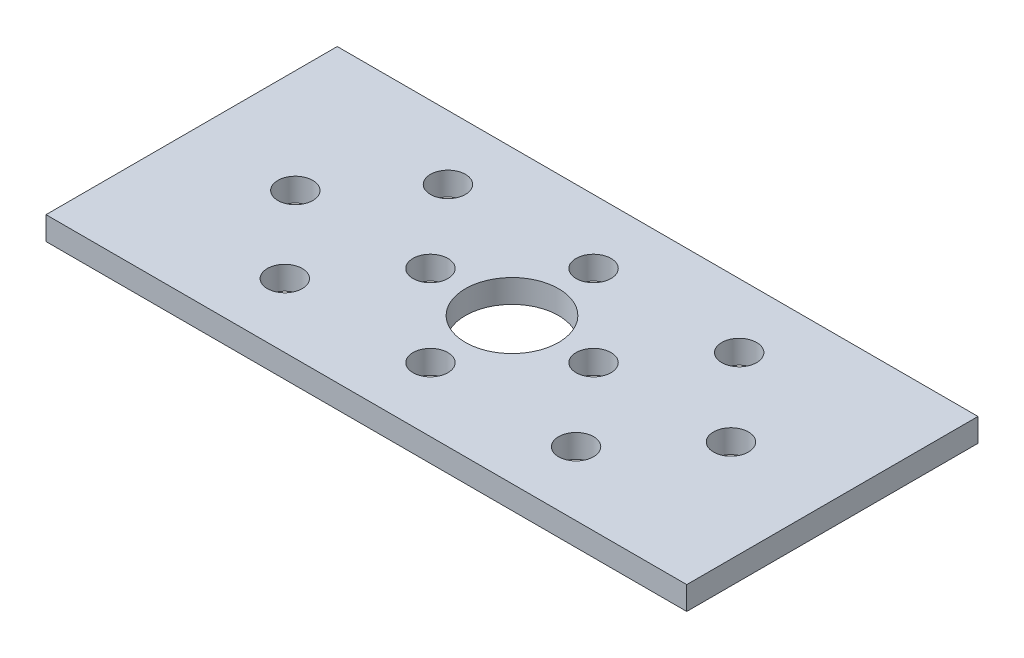
ISO-10303-21;
HEADER;
FILE_DESCRIPTION(('STEP AP214'),'2;1');
FILE_NAME('part.step','',(''),(''),'','','');
FILE_SCHEMA(('AUTOMOTIVE_DESIGN { 1 0 10303 214 1 1 1 1 }'));
ENDSEC;
DATA;
#1=APPLICATION_CONTEXT('core data for automotive mechanical design processes');
#2=APPLICATION_PROTOCOL_DEFINITION('international standard','automotive_design',2000,#1);
#3=PRODUCT_CONTEXT('',#1,'mechanical');
#4=PRODUCT('Part','Part','',(#3));
#5=PRODUCT_RELATED_PRODUCT_CATEGORY('part','',(#4));
#6=PRODUCT_DEFINITION_FORMATION('','',#4);
#7=PRODUCT_DEFINITION_CONTEXT('part definition',#1,'design');
#8=PRODUCT_DEFINITION('design','',#6,#7);
#9=PRODUCT_DEFINITION_SHAPE('','',#8);
#10=(LENGTH_UNIT() NAMED_UNIT(*) SI_UNIT(.MILLI.,.METRE.));
#11=(NAMED_UNIT(*) PLANE_ANGLE_UNIT() SI_UNIT($,.RADIAN.));
#12=(NAMED_UNIT(*) SI_UNIT($,.STERADIAN.) SOLID_ANGLE_UNIT());
#13=UNCERTAINTY_MEASURE_WITH_UNIT(LENGTH_MEASURE(1.E-05),#10,'distance_accuracy_value','');
#14=(GEOMETRIC_REPRESENTATION_CONTEXT(3) GLOBAL_UNCERTAINTY_ASSIGNED_CONTEXT((#13)) GLOBAL_UNIT_ASSIGNED_CONTEXT((#10,
#11,#12)) REPRESENTATION_CONTEXT('',''));
#15=CARTESIAN_POINT('',(0.,0.,0.));
#16=DIRECTION('',(0.,0.,1.));
#17=DIRECTION('',(1.,0.,0.));
#18=AXIS2_PLACEMENT_3D('',#15,#16,#17);
#19=CARTESIAN_POINT('',(0.,2.,0.));
#20=DIRECTION('',(0.,-1.,0.));
#21=DIRECTION('',(0.,0.,-1.));
#22=AXIS2_PLACEMENT_3D('',#19,#20,#21);
#23=PLANE('',#22);
#24=DIRECTION('',(0.,0.,-1.));
#25=VECTOR('',#24,1.);
#26=CARTESIAN_POINT('',(27.5,2.,12.5));
#27=LINE('',#26,#25);
#28=CARTESIAN_POINT('',(27.5,2.,12.5));
#29=VERTEX_POINT('',#28);
#30=CARTESIAN_POINT('',(27.5,2.,-12.5));
#31=VERTEX_POINT('',#30);
#32=EDGE_CURVE('E85',#29,#31,#27,.T.);
#33=ORIENTED_EDGE('',*,*,#32,.T.);
#34=DIRECTION('',(-1.,0.,0.));
#35=VECTOR('',#34,1.);
#36=CARTESIAN_POINT('',(-27.5,2.,-12.5));
#37=LINE('',#36,#35);
#38=CARTESIAN_POINT('',(-27.5,2.,-12.5));
#39=VERTEX_POINT('',#38);
#40=EDGE_CURVE('E80',#31,#39,#37,.T.);
#41=ORIENTED_EDGE('',*,*,#40,.T.);
#42=DIRECTION('',(0.,0.,1.));
#43=VECTOR('',#42,1.);
#44=CARTESIAN_POINT('',(-27.5,2.,12.5));
#45=LINE('',#44,#43);
#46=CARTESIAN_POINT('',(-27.5,2.,12.5));
#47=VERTEX_POINT('',#46);
#48=EDGE_CURVE('E83',#39,#47,#45,.T.);
#49=ORIENTED_EDGE('',*,*,#48,.T.);
#50=DIRECTION('',(1.,0.,0.));
#51=VECTOR('',#50,1.);
#52=CARTESIAN_POINT('',(-27.5,2.,12.5));
#53=LINE('',#52,#51);
#54=EDGE_CURVE('E50',#47,#29,#53,.T.);
#55=ORIENTED_EDGE('',*,*,#54,.T.);
#56=EDGE_LOOP('',(#33,#41,#49,#55));
#57=FACE_BOUND('',#56,.T.);
#58=CARTESIAN_POINT('',(0.,2.,-7.));
#59=DIRECTION('',(0.,1.,0.));
#60=DIRECTION('',(0.,0.,1.));
#61=AXIS2_PLACEMENT_3D('',#58,#59,#60);
#62=CIRCLE('',#61,1.5);
#63=CARTESIAN_POINT('',(0.,2.,-5.5));
#64=VERTEX_POINT('',#63);
#65=EDGE_CURVE('E100',#64,#64,#62,.T.);
#66=ORIENTED_EDGE('',*,*,#65,.F.);
#67=EDGE_LOOP('',(#66));
#68=FACE_BOUND('',#67,.T.);
#69=CARTESIAN_POINT('',(7.,2.,0.));
#70=DIRECTION('',(0.,1.,0.));
#71=DIRECTION('',(0.,0.,1.));
#72=AXIS2_PLACEMENT_3D('',#69,#70,#71);
#73=CIRCLE('',#72,1.5);
#74=CARTESIAN_POINT('',(7.,2.,1.5));
#75=VERTEX_POINT('',#74);
#76=EDGE_CURVE('E115',#75,#75,#73,.T.);
#77=ORIENTED_EDGE('',*,*,#76,.F.);
#78=EDGE_LOOP('',(#77));
#79=FACE_BOUND('',#78,.T.);
#80=CARTESIAN_POINT('',(0.,2.,7.));
#81=DIRECTION('',(0.,1.,0.));
#82=DIRECTION('',(0.,0.,1.));
#83=AXIS2_PLACEMENT_3D('',#80,#81,#82);
#84=CIRCLE('',#83,1.5);
#85=CARTESIAN_POINT('',(0.,2.,8.5));
#86=VERTEX_POINT('',#85);
#87=EDGE_CURVE('E121',#86,#86,#84,.T.);
#88=ORIENTED_EDGE('',*,*,#87,.F.);
#89=EDGE_LOOP('',(#88));
#90=FACE_BOUND('',#89,.T.);
#91=CARTESIAN_POINT('',(-7.,2.,0.));
#92=DIRECTION('',(0.,1.,0.));
#93=DIRECTION('',(0.,0.,1.));
#94=AXIS2_PLACEMENT_3D('',#91,#92,#93);
#95=CIRCLE('',#94,1.5);
#96=CARTESIAN_POINT('',(-7.,2.,1.5));
#97=VERTEX_POINT('',#96);
#98=EDGE_CURVE('E127',#97,#97,#95,.T.);
#99=ORIENTED_EDGE('',*,*,#98,.F.);
#100=EDGE_LOOP('',(#99));
#101=FACE_BOUND('',#100,.T.);
#102=CARTESIAN_POINT('',(-18.5986879373947,2.,0.));
#103=DIRECTION('',(0.,1.,0.));
#104=DIRECTION('',(0.,0.,1.));
#105=AXIS2_PLACEMENT_3D('',#102,#103,#104);
#106=CIRCLE('',#105,1.5);
#107=CARTESIAN_POINT('',(-18.5986879373947,2.,1.5));
#108=VERTEX_POINT('',#107);
#109=EDGE_CURVE('E133',#108,#108,#106,.T.);
#110=ORIENTED_EDGE('',*,*,#109,.F.);
#111=EDGE_LOOP('',(#110));
#112=FACE_BOUND('',#111,.T.);
#113=CARTESIAN_POINT('',(12.5,2.,-7.));
#114=DIRECTION('',(0.,1.,0.));
#115=DIRECTION('',(0.,0.,1.));
#116=AXIS2_PLACEMENT_3D('',#113,#114,#115);
#117=CIRCLE('',#116,1.5);
#118=CARTESIAN_POINT('',(12.5,2.,-5.5));
#119=VERTEX_POINT('',#118);
#120=EDGE_CURVE('E139',#119,#119,#117,.T.);
#121=ORIENTED_EDGE('',*,*,#120,.F.);
#122=EDGE_LOOP('',(#121));
#123=FACE_BOUND('',#122,.T.);
#124=CARTESIAN_POINT('',(12.5,2.,7.));
#125=DIRECTION('',(0.,1.,0.));
#126=DIRECTION('',(0.,0.,-1.));
#127=AXIS2_PLACEMENT_3D('',#124,#125,#126);
#128=CIRCLE('',#127,1.5);
#129=CARTESIAN_POINT('',(12.5,2.,5.5));
#130=VERTEX_POINT('',#129);
#131=EDGE_CURVE('E145',#130,#130,#128,.T.);
#132=ORIENTED_EDGE('',*,*,#131,.F.);
#133=EDGE_LOOP('',(#132));
#134=FACE_BOUND('',#133,.T.);
#135=CARTESIAN_POINT('',(-12.5,2.,7.));
#136=DIRECTION('',(0.,1.,0.));
#137=DIRECTION('',(0.,0.,1.));
#138=AXIS2_PLACEMENT_3D('',#135,#136,#137);
#139=CIRCLE('',#138,1.5);
#140=CARTESIAN_POINT('',(-12.5,2.,8.5));
#141=VERTEX_POINT('',#140);
#142=EDGE_CURVE('E151',#141,#141,#139,.T.);
#143=ORIENTED_EDGE('',*,*,#142,.F.);
#144=EDGE_LOOP('',(#143));
#145=FACE_BOUND('',#144,.T.);
#146=CARTESIAN_POINT('',(0.,2.,0.));
#147=DIRECTION('',(0.,1.,0.));
#148=DIRECTION('',(0.,0.,1.));
#149=AXIS2_PLACEMENT_3D('',#146,#147,#148);
#150=CIRCLE('',#149,4.);
#151=CARTESIAN_POINT('',(0.,2.,4.));
#152=VERTEX_POINT('',#151);
#153=EDGE_CURVE('E157',#152,#152,#150,.T.);
#154=ORIENTED_EDGE('',*,*,#153,.F.);
#155=EDGE_LOOP('',(#154));
#156=FACE_BOUND('',#155,.T.);
#157=CARTESIAN_POINT('',(18.7959419436398,2.,0.));
#158=DIRECTION('',(0.,1.,0.));
#159=DIRECTION('',(0.,0.,1.));
#160=AXIS2_PLACEMENT_3D('',#157,#158,#159);
#161=CIRCLE('',#160,1.5);
#162=CARTESIAN_POINT('',(18.7959419436398,2.,1.5));
#163=VERTEX_POINT('',#162);
#164=EDGE_CURVE('E163',#163,#163,#161,.T.);
#165=ORIENTED_EDGE('',*,*,#164,.F.);
#166=EDGE_LOOP('',(#165));
#167=FACE_BOUND('',#166,.T.);
#168=CARTESIAN_POINT('',(-12.5,2.,-7.));
#169=DIRECTION('',(0.,1.,0.));
#170=DIRECTION('',(0.,0.,-1.));
#171=AXIS2_PLACEMENT_3D('',#168,#169,#170);
#172=CIRCLE('',#171,1.5);
#173=CARTESIAN_POINT('',(-12.5,2.,-8.5));
#174=VERTEX_POINT('',#173);
#175=EDGE_CURVE('E169',#174,#174,#172,.T.);
#176=ORIENTED_EDGE('',*,*,#175,.F.);
#177=EDGE_LOOP('',(#176));
#178=FACE_BOUND('',#177,.T.);
#179=ADVANCED_FACE('F33',(#57,#68,#79,#90,#101,#112,#123,#134,#145,#156,#167,#178),#23,.F.);
#180=CARTESIAN_POINT('',(0.,0.,0.));
#181=DIRECTION('',(0.,-1.,0.));
#182=DIRECTION('',(0.,0.,-1.));
#183=AXIS2_PLACEMENT_3D('',#180,#181,#182);
#184=PLANE('',#183);
#185=CARTESIAN_POINT('',(18.7959419436398,0.,0.));
#186=DIRECTION('',(0.,1.,0.));
#187=DIRECTION('',(0.,0.,1.));
#188=AXIS2_PLACEMENT_3D('',#185,#186,#187);
#189=CIRCLE('',#188,1.5);
#190=CARTESIAN_POINT('',(18.7959419436398,0.,1.5));
#191=VERTEX_POINT('',#190);
#192=EDGE_CURVE('E166',#191,#191,#189,.T.);
#193=ORIENTED_EDGE('',*,*,#192,.T.);
#194=EDGE_LOOP('',(#193));
#195=FACE_BOUND('',#194,.T.);
#196=CARTESIAN_POINT('',(-12.5,0.,7.));
#197=DIRECTION('',(0.,1.,0.));
#198=DIRECTION('',(0.,0.,1.));
#199=AXIS2_PLACEMENT_3D('',#196,#197,#198);
#200=CIRCLE('',#199,1.5);
#201=CARTESIAN_POINT('',(-12.5,0.,8.5));
#202=VERTEX_POINT('',#201);
#203=EDGE_CURVE('E154',#202,#202,#200,.T.);
#204=ORIENTED_EDGE('',*,*,#203,.T.);
#205=EDGE_LOOP('',(#204));
#206=FACE_BOUND('',#205,.T.);
#207=CARTESIAN_POINT('',(12.5,0.,-7.));
#208=DIRECTION('',(0.,1.,0.));
#209=DIRECTION('',(0.,0.,1.));
#210=AXIS2_PLACEMENT_3D('',#207,#208,#209);
#211=CIRCLE('',#210,1.5);
#212=CARTESIAN_POINT('',(12.5,0.,-5.5));
#213=VERTEX_POINT('',#212);
#214=EDGE_CURVE('E142',#213,#213,#211,.T.);
#215=ORIENTED_EDGE('',*,*,#214,.T.);
#216=EDGE_LOOP('',(#215));
#217=FACE_BOUND('',#216,.T.);
#218=CARTESIAN_POINT('',(-7.,0.,0.));
#219=DIRECTION('',(0.,1.,0.));
#220=DIRECTION('',(0.,0.,1.));
#221=AXIS2_PLACEMENT_3D('',#218,#219,#220);
#222=CIRCLE('',#221,1.5);
#223=CARTESIAN_POINT('',(-7.,0.,1.5));
#224=VERTEX_POINT('',#223);
#225=EDGE_CURVE('E130',#224,#224,#222,.T.);
#226=ORIENTED_EDGE('',*,*,#225,.T.);
#227=EDGE_LOOP('',(#226));
#228=FACE_BOUND('',#227,.T.);
#229=CARTESIAN_POINT('',(7.,0.,0.));
#230=DIRECTION('',(0.,1.,0.));
#231=DIRECTION('',(0.,0.,1.));
#232=AXIS2_PLACEMENT_3D('',#229,#230,#231);
#233=CIRCLE('',#232,1.5);
#234=CARTESIAN_POINT('',(7.,0.,1.5));
#235=VERTEX_POINT('',#234);
#236=EDGE_CURVE('E118',#235,#235,#233,.T.);
#237=ORIENTED_EDGE('',*,*,#236,.T.);
#238=EDGE_LOOP('',(#237));
#239=FACE_BOUND('',#238,.T.);
#240=DIRECTION('',(0.,0.,-1.));
#241=VECTOR('',#240,1.);
#242=CARTESIAN_POINT('',(27.5,0.,12.5));
#243=LINE('',#242,#241);
#244=CARTESIAN_POINT('',(27.5,0.,12.5));
#245=VERTEX_POINT('',#244);
#246=CARTESIAN_POINT('',(27.5,0.,-12.5));
#247=VERTEX_POINT('',#246);
#248=EDGE_CURVE('E97',#245,#247,#243,.T.);
#249=ORIENTED_EDGE('',*,*,#248,.F.);
#250=DIRECTION('',(1.,0.,0.));
#251=VECTOR('',#250,1.);
#252=CARTESIAN_POINT('',(-27.5,0.,12.5));
#253=LINE('',#252,#251);
#254=CARTESIAN_POINT('',(-27.5,0.,12.5));
#255=VERTEX_POINT('',#254);
#256=EDGE_CURVE('E73',#255,#245,#253,.T.);
#257=ORIENTED_EDGE('',*,*,#256,.F.);
#258=DIRECTION('',(0.,0.,1.));
#259=VECTOR('',#258,1.);
#260=CARTESIAN_POINT('',(-27.5,0.,12.5));
#261=LINE('',#260,#259);
#262=CARTESIAN_POINT('',(-27.5,0.,-12.5));
#263=VERTEX_POINT('',#262);
#264=EDGE_CURVE('E67',#263,#255,#261,.T.);
#265=ORIENTED_EDGE('',*,*,#264,.F.);
#266=DIRECTION('',(-1.,0.,0.));
#267=VECTOR('',#266,1.);
#268=CARTESIAN_POINT('',(-27.5,0.,-12.5));
#269=LINE('',#268,#267);
#270=EDGE_CURVE('E89',#247,#263,#269,.T.);
#271=ORIENTED_EDGE('',*,*,#270,.F.);
#272=EDGE_LOOP('',(#249,#257,#265,#271));
#273=FACE_BOUND('',#272,.T.);
#274=CARTESIAN_POINT('',(0.,0.,-7.));
#275=DIRECTION('',(0.,1.,0.));
#276=DIRECTION('',(0.,0.,1.));
#277=AXIS2_PLACEMENT_3D('',#274,#275,#276);
#278=CIRCLE('',#277,1.5);
#279=CARTESIAN_POINT('',(0.,0.,-5.5));
#280=VERTEX_POINT('',#279);
#281=EDGE_CURVE('E112',#280,#280,#278,.T.);
#282=ORIENTED_EDGE('',*,*,#281,.T.);
#283=EDGE_LOOP('',(#282));
#284=FACE_BOUND('',#283,.T.);
#285=CARTESIAN_POINT('',(0.,0.,7.));
#286=DIRECTION('',(0.,1.,0.));
#287=DIRECTION('',(0.,0.,1.));
#288=AXIS2_PLACEMENT_3D('',#285,#286,#287);
#289=CIRCLE('',#288,1.5);
#290=CARTESIAN_POINT('',(0.,0.,8.5));
#291=VERTEX_POINT('',#290);
#292=EDGE_CURVE('E124',#291,#291,#289,.T.);
#293=ORIENTED_EDGE('',*,*,#292,.T.);
#294=EDGE_LOOP('',(#293));
#295=FACE_BOUND('',#294,.T.);
#296=CARTESIAN_POINT('',(-18.5986879373947,0.,0.));
#297=DIRECTION('',(0.,1.,0.));
#298=DIRECTION('',(0.,0.,1.));
#299=AXIS2_PLACEMENT_3D('',#296,#297,#298);
#300=CIRCLE('',#299,1.5);
#301=CARTESIAN_POINT('',(-18.5986879373947,0.,1.5));
#302=VERTEX_POINT('',#301);
#303=EDGE_CURVE('E136',#302,#302,#300,.T.);
#304=ORIENTED_EDGE('',*,*,#303,.T.);
#305=EDGE_LOOP('',(#304));
#306=FACE_BOUND('',#305,.T.);
#307=CARTESIAN_POINT('',(12.5,0.,7.));
#308=DIRECTION('',(0.,1.,0.));
#309=DIRECTION('',(0.,0.,-1.));
#310=AXIS2_PLACEMENT_3D('',#307,#308,#309);
#311=CIRCLE('',#310,1.5);
#312=CARTESIAN_POINT('',(12.5,0.,5.5));
#313=VERTEX_POINT('',#312);
#314=EDGE_CURVE('E148',#313,#313,#311,.T.);
#315=ORIENTED_EDGE('',*,*,#314,.T.);
#316=EDGE_LOOP('',(#315));
#317=FACE_BOUND('',#316,.T.);
#318=CARTESIAN_POINT('',(0.,0.,0.));
#319=DIRECTION('',(0.,1.,0.));
#320=DIRECTION('',(0.,0.,1.));
#321=AXIS2_PLACEMENT_3D('',#318,#319,#320);
#322=CIRCLE('',#321,4.);
#323=CARTESIAN_POINT('',(0.,0.,4.));
#324=VERTEX_POINT('',#323);
#325=EDGE_CURVE('E160',#324,#324,#322,.T.);
#326=ORIENTED_EDGE('',*,*,#325,.T.);
#327=EDGE_LOOP('',(#326));
#328=FACE_BOUND('',#327,.T.);
#329=CARTESIAN_POINT('',(-12.5,0.,-7.));
#330=DIRECTION('',(0.,1.,0.));
#331=DIRECTION('',(0.,0.,-1.));
#332=AXIS2_PLACEMENT_3D('',#329,#330,#331);
#333=CIRCLE('',#332,1.5);
#334=CARTESIAN_POINT('',(-12.5,0.,-8.5));
#335=VERTEX_POINT('',#334);
#336=EDGE_CURVE('E172',#335,#335,#333,.T.);
#337=ORIENTED_EDGE('',*,*,#336,.T.);
#338=EDGE_LOOP('',(#337));
#339=FACE_BOUND('',#338,.T.);
#340=ADVANCED_FACE('F108',(#195,#206,#217,#228,#239,#273,#284,#295,#306,#317,#328,#339),#184,.T.);
#341=CARTESIAN_POINT('',(27.5,2.,12.5));
#342=DIRECTION('',(-1.,0.,0.));
#343=DIRECTION('',(0.,0.,1.));
#344=AXIS2_PLACEMENT_3D('',#341,#342,#343);
#345=PLANE('',#344);
#346=ORIENTED_EDGE('',*,*,#248,.T.);
#347=DIRECTION('',(0.,-1.,0.));
#348=VECTOR('',#347,1.);
#349=CARTESIAN_POINT('',(27.5,2.,-12.5));
#350=LINE('',#349,#348);
#351=EDGE_CURVE('E11',#31,#247,#350,.T.);
#352=ORIENTED_EDGE('',*,*,#351,.F.);
#353=ORIENTED_EDGE('',*,*,#32,.F.);
#354=DIRECTION('',(0.,-1.,0.));
#355=VECTOR('',#354,1.);
#356=CARTESIAN_POINT('',(27.5,2.,12.5));
#357=LINE('',#356,#355);
#358=EDGE_CURVE('E93',#29,#245,#357,.T.);
#359=ORIENTED_EDGE('',*,*,#358,.T.);
#360=EDGE_LOOP('',(#346,#352,#353,#359));
#361=FACE_BOUND('',#360,.T.);
#362=ADVANCED_FACE('F35',(#361),#345,.F.);
#363=CARTESIAN_POINT('',(-27.5,2.,-12.5));
#364=DIRECTION('',(0.,0.,1.));
#365=DIRECTION('',(1.,0.,0.));
#366=AXIS2_PLACEMENT_3D('',#363,#364,#365);
#367=PLANE('',#366);
#368=ORIENTED_EDGE('',*,*,#270,.T.);
#369=DIRECTION('',(0.,-1.,0.));
#370=VECTOR('',#369,1.);
#371=CARTESIAN_POINT('',(-27.5,2.,-12.5));
#372=LINE('',#371,#370);
#373=EDGE_CURVE('E42',#39,#263,#372,.T.);
#374=ORIENTED_EDGE('',*,*,#373,.F.);
#375=ORIENTED_EDGE('',*,*,#40,.F.);
#376=ORIENTED_EDGE('',*,*,#351,.T.);
#377=EDGE_LOOP('',(#368,#374,#375,#376));
#378=FACE_BOUND('',#377,.T.);
#379=ADVANCED_FACE('F88',(#378),#367,.F.);
#380=CARTESIAN_POINT('',(-27.5,2.,12.5));
#381=DIRECTION('',(1.,0.,0.));
#382=DIRECTION('',(0.,0.,-1.));
#383=AXIS2_PLACEMENT_3D('',#380,#381,#382);
#384=PLANE('',#383);
#385=ORIENTED_EDGE('',*,*,#264,.T.);
#386=DIRECTION('',(0.,-1.,0.));
#387=VECTOR('',#386,1.);
#388=CARTESIAN_POINT('',(-27.5,2.,12.5));
#389=LINE('',#388,#387);
#390=EDGE_CURVE('E90',#47,#255,#389,.T.);
#391=ORIENTED_EDGE('',*,*,#390,.F.);
#392=ORIENTED_EDGE('',*,*,#48,.F.);
#393=ORIENTED_EDGE('',*,*,#373,.T.);
#394=EDGE_LOOP('',(#385,#391,#392,#393));
#395=FACE_BOUND('',#394,.T.);
#396=ADVANCED_FACE('F91',(#395),#384,.F.);
#397=CARTESIAN_POINT('',(-27.5,2.,12.5));
#398=DIRECTION('',(0.,0.,-1.));
#399=DIRECTION('',(-1.,0.,0.));
#400=AXIS2_PLACEMENT_3D('',#397,#398,#399);
#401=PLANE('',#400);
#402=ORIENTED_EDGE('',*,*,#256,.T.);
#403=ORIENTED_EDGE('',*,*,#358,.F.);
#404=ORIENTED_EDGE('',*,*,#54,.F.);
#405=ORIENTED_EDGE('',*,*,#390,.T.);
#406=EDGE_LOOP('',(#402,#403,#404,#405));
#407=FACE_BOUND('',#406,.T.);
#408=ADVANCED_FACE('F105',(#407),#401,.F.);
#409=CARTESIAN_POINT('',(0.,2.,-7.));
#410=DIRECTION('',(0.,-1.,0.));
#411=DIRECTION('',(0.,0.,-1.));
#412=AXIS2_PLACEMENT_3D('',#409,#410,#411);
#413=CYLINDRICAL_SURFACE('',#412,1.5);
#414=ORIENTED_EDGE('',*,*,#65,.T.);
#415=EDGE_LOOP('',(#414));
#416=FACE_BOUND('',#415,.T.);
#417=ORIENTED_EDGE('',*,*,#281,.F.);
#418=EDGE_LOOP('',(#417));
#419=FACE_BOUND('',#418,.T.);
#420=ADVANCED_FACE('F189',(#416,#419),#413,.F.);
#421=CARTESIAN_POINT('',(7.,2.,0.));
#422=DIRECTION('',(0.,-1.,0.));
#423=DIRECTION('',(0.,0.,-1.));
#424=AXIS2_PLACEMENT_3D('',#421,#422,#423);
#425=CYLINDRICAL_SURFACE('',#424,1.5);
#426=ORIENTED_EDGE('',*,*,#76,.T.);
#427=EDGE_LOOP('',(#426));
#428=FACE_BOUND('',#427,.T.);
#429=ORIENTED_EDGE('',*,*,#236,.F.);
#430=EDGE_LOOP('',(#429));
#431=FACE_BOUND('',#430,.T.);
#432=ADVANCED_FACE('F235',(#428,#431),#425,.F.);
#433=CARTESIAN_POINT('',(0.,2.,7.));
#434=DIRECTION('',(0.,-1.,0.));
#435=DIRECTION('',(0.,0.,-1.));
#436=AXIS2_PLACEMENT_3D('',#433,#434,#435);
#437=CYLINDRICAL_SURFACE('',#436,1.5);
#438=ORIENTED_EDGE('',*,*,#87,.T.);
#439=EDGE_LOOP('',(#438));
#440=FACE_BOUND('',#439,.T.);
#441=ORIENTED_EDGE('',*,*,#292,.F.);
#442=EDGE_LOOP('',(#441));
#443=FACE_BOUND('',#442,.T.);
#444=ADVANCED_FACE('F243',(#440,#443),#437,.F.);
#445=CARTESIAN_POINT('',(-7.,2.,0.));
#446=DIRECTION('',(0.,-1.,0.));
#447=DIRECTION('',(0.,0.,-1.));
#448=AXIS2_PLACEMENT_3D('',#445,#446,#447);
#449=CYLINDRICAL_SURFACE('',#448,1.5);
#450=ORIENTED_EDGE('',*,*,#98,.T.);
#451=EDGE_LOOP('',(#450));
#452=FACE_BOUND('',#451,.T.);
#453=ORIENTED_EDGE('',*,*,#225,.F.);
#454=EDGE_LOOP('',(#453));
#455=FACE_BOUND('',#454,.T.);
#456=ADVANCED_FACE('F251',(#452,#455),#449,.F.);
#457=CARTESIAN_POINT('',(-18.5986879373947,2.,0.));
#458=DIRECTION('',(0.,-1.,0.));
#459=DIRECTION('',(0.,0.,-1.));
#460=AXIS2_PLACEMENT_3D('',#457,#458,#459);
#461=CYLINDRICAL_SURFACE('',#460,1.5);
#462=ORIENTED_EDGE('',*,*,#109,.T.);
#463=EDGE_LOOP('',(#462));
#464=FACE_BOUND('',#463,.T.);
#465=ORIENTED_EDGE('',*,*,#303,.F.);
#466=EDGE_LOOP('',(#465));
#467=FACE_BOUND('',#466,.T.);
#468=ADVANCED_FACE('F260',(#464,#467),#461,.F.);
#469=CARTESIAN_POINT('',(12.5,2.,-7.));
#470=DIRECTION('',(0.,-1.,0.));
#471=DIRECTION('',(0.,0.,-1.));
#472=AXIS2_PLACEMENT_3D('',#469,#470,#471);
#473=CYLINDRICAL_SURFACE('',#472,1.5);
#474=ORIENTED_EDGE('',*,*,#120,.T.);
#475=EDGE_LOOP('',(#474));
#476=FACE_BOUND('',#475,.T.);
#477=ORIENTED_EDGE('',*,*,#214,.F.);
#478=EDGE_LOOP('',(#477));
#479=FACE_BOUND('',#478,.T.);
#480=ADVANCED_FACE('F269',(#476,#479),#473,.F.);
#481=CARTESIAN_POINT('',(12.5,2.,7.));
#482=DIRECTION('',(0.,-1.,0.));
#483=DIRECTION('',(0.,0.,-1.));
#484=AXIS2_PLACEMENT_3D('',#481,#482,#483);
#485=CYLINDRICAL_SURFACE('',#484,1.5);
#486=ORIENTED_EDGE('',*,*,#131,.T.);
#487=EDGE_LOOP('',(#486));
#488=FACE_BOUND('',#487,.T.);
#489=ORIENTED_EDGE('',*,*,#314,.F.);
#490=EDGE_LOOP('',(#489));
#491=FACE_BOUND('',#490,.T.);
#492=ADVANCED_FACE('F278',(#488,#491),#485,.F.);
#493=CARTESIAN_POINT('',(-12.5,2.,7.));
#494=DIRECTION('',(0.,-1.,0.));
#495=DIRECTION('',(0.,0.,-1.));
#496=AXIS2_PLACEMENT_3D('',#493,#494,#495);
#497=CYLINDRICAL_SURFACE('',#496,1.5);
#498=ORIENTED_EDGE('',*,*,#142,.T.);
#499=EDGE_LOOP('',(#498));
#500=FACE_BOUND('',#499,.T.);
#501=ORIENTED_EDGE('',*,*,#203,.F.);
#502=EDGE_LOOP('',(#501));
#503=FACE_BOUND('',#502,.T.);
#504=ADVANCED_FACE('F287',(#500,#503),#497,.F.);
#505=CARTESIAN_POINT('',(0.,2.,0.));
#506=DIRECTION('',(0.,-1.,0.));
#507=DIRECTION('',(0.,0.,-1.));
#508=AXIS2_PLACEMENT_3D('',#505,#506,#507);
#509=CYLINDRICAL_SURFACE('',#508,4.);
#510=ORIENTED_EDGE('',*,*,#153,.T.);
#511=EDGE_LOOP('',(#510));
#512=FACE_BOUND('',#511,.T.);
#513=ORIENTED_EDGE('',*,*,#325,.F.);
#514=EDGE_LOOP('',(#513));
#515=FACE_BOUND('',#514,.T.);
#516=ADVANCED_FACE('F296',(#512,#515),#509,.F.);
#517=CARTESIAN_POINT('',(18.7959419436398,2.,0.));
#518=DIRECTION('',(0.,-1.,0.));
#519=DIRECTION('',(0.,0.,-1.));
#520=AXIS2_PLACEMENT_3D('',#517,#518,#519);
#521=CYLINDRICAL_SURFACE('',#520,1.5);
#522=ORIENTED_EDGE('',*,*,#164,.T.);
#523=EDGE_LOOP('',(#522));
#524=FACE_BOUND('',#523,.T.);
#525=ORIENTED_EDGE('',*,*,#192,.F.);
#526=EDGE_LOOP('',(#525));
#527=FACE_BOUND('',#526,.T.);
#528=ADVANCED_FACE('F305',(#524,#527),#521,.F.);
#529=CARTESIAN_POINT('',(-12.5,2.,-7.));
#530=DIRECTION('',(0.,-1.,0.));
#531=DIRECTION('',(0.,0.,-1.));
#532=AXIS2_PLACEMENT_3D('',#529,#530,#531);
#533=CYLINDRICAL_SURFACE('',#532,1.5);
#534=ORIENTED_EDGE('',*,*,#175,.T.);
#535=EDGE_LOOP('',(#534));
#536=FACE_BOUND('',#535,.T.);
#537=ORIENTED_EDGE('',*,*,#336,.F.);
#538=EDGE_LOOP('',(#537));
#539=FACE_BOUND('',#538,.T.);
#540=ADVANCED_FACE('F178',(#536,#539),#533,.F.);
#541=CLOSED_SHELL('',(#179,#340,#362,#379,#396,#408,#420,#432,#444,#456,#468,#480,#492,#504,
#516,#528,#540));
#542=MANIFOLD_SOLID_BREP('B2',#541);
#543=ADVANCED_BREP_SHAPE_REPRESENTATION('',(#18,#542),#14);
#544=SHAPE_DEFINITION_REPRESENTATION(#9,#543);
ENDSEC;
END-ISO-10303-21;
